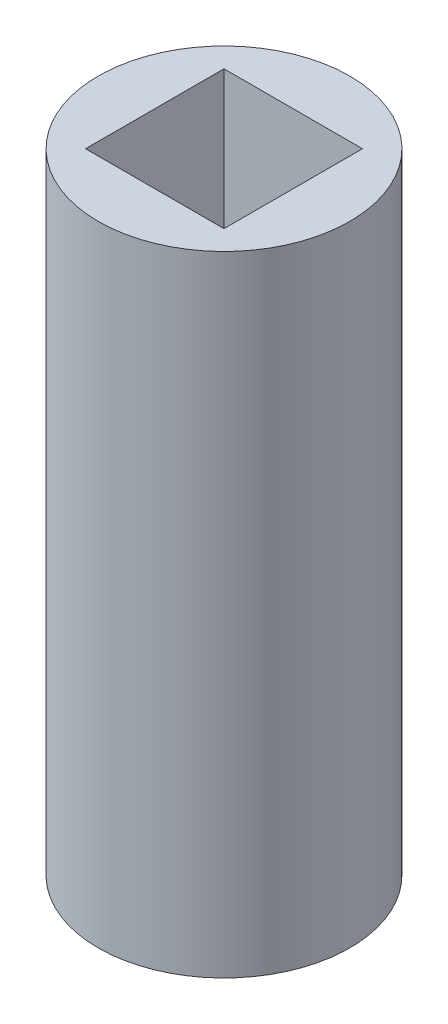
ISO-10303-21;
HEADER;
FILE_DESCRIPTION(('STEP AP214'),'2;1');
FILE_NAME('part.step','',(''),(''),'','','');
FILE_SCHEMA(('AUTOMOTIVE_DESIGN { 1 0 10303 214 1 1 1 1 }'));
ENDSEC;
DATA;
#1=APPLICATION_CONTEXT('core data for automotive mechanical design processes');
#2=APPLICATION_PROTOCOL_DEFINITION('international standard','automotive_design',2000,#1);
#3=PRODUCT_CONTEXT('',#1,'mechanical');
#4=PRODUCT('Part','Part','',(#3));
#5=PRODUCT_RELATED_PRODUCT_CATEGORY('part','',(#4));
#6=PRODUCT_DEFINITION_FORMATION('','',#4);
#7=PRODUCT_DEFINITION_CONTEXT('part definition',#1,'design');
#8=PRODUCT_DEFINITION('design','',#6,#7);
#9=PRODUCT_DEFINITION_SHAPE('','',#8);
#10=(LENGTH_UNIT() NAMED_UNIT(*) SI_UNIT(.MILLI.,.METRE.));
#11=(NAMED_UNIT(*) PLANE_ANGLE_UNIT() SI_UNIT($,.RADIAN.));
#12=(NAMED_UNIT(*) SI_UNIT($,.STERADIAN.) SOLID_ANGLE_UNIT());
#13=UNCERTAINTY_MEASURE_WITH_UNIT(LENGTH_MEASURE(1.E-05),#10,'distance_accuracy_value','');
#14=(GEOMETRIC_REPRESENTATION_CONTEXT(3) GLOBAL_UNCERTAINTY_ASSIGNED_CONTEXT((#13)) GLOBAL_UNIT_ASSIGNED_CONTEXT((#10,
#11,#12)) REPRESENTATION_CONTEXT('',''));
#15=CARTESIAN_POINT('',(0.,0.,0.));
#16=DIRECTION('',(0.,0.,1.));
#17=DIRECTION('',(1.,0.,0.));
#18=AXIS2_PLACEMENT_3D('',#15,#16,#17);
#19=CARTESIAN_POINT('',(0.,30.,0.));
#20=DIRECTION('',(0.,1.,0.));
#21=DIRECTION('',(0.,0.,1.));
#22=AXIS2_PLACEMENT_3D('',#19,#20,#21);
#23=PLANE('',#22);
#24=CARTESIAN_POINT('',(0.,30.,0.));
#25=DIRECTION('',(0.,1.,0.));
#26=DIRECTION('',(0.,0.,1.));
#27=AXIS2_PLACEMENT_3D('',#24,#25,#26);
#28=CIRCLE('',#27,6.);
#29=CARTESIAN_POINT('',(0.,30.,6.));
#30=VERTEX_POINT('',#29);
#31=EDGE_CURVE('E11',#30,#30,#28,.T.);
#32=ORIENTED_EDGE('',*,*,#31,.T.);
#33=EDGE_LOOP('',(#32));
#34=FACE_BOUND('',#33,.T.);
#35=DIRECTION('',(1.,0.,0.));
#36=VECTOR('',#35,1.);
#37=CARTESIAN_POINT('',(-3.3,30.,3.3));
#38=LINE('',#37,#36);
#39=CARTESIAN_POINT('',(-3.3,30.,3.3));
#40=VERTEX_POINT('',#39);
#41=CARTESIAN_POINT('',(3.3,30.,3.3));
#42=VERTEX_POINT('',#41);
#43=EDGE_CURVE('E90',#40,#42,#38,.T.);
#44=ORIENTED_EDGE('',*,*,#43,.F.);
#45=DIRECTION('',(0.,0.,1.));
#46=VECTOR('',#45,1.);
#47=CARTESIAN_POINT('',(-3.3,30.,-3.3));
#48=LINE('',#47,#46);
#49=CARTESIAN_POINT('',(-3.3,30.,-3.3));
#50=VERTEX_POINT('',#49);
#51=EDGE_CURVE('E81',#50,#40,#48,.T.);
#52=ORIENTED_EDGE('',*,*,#51,.F.);
#53=DIRECTION('',(-1.,0.,0.));
#54=VECTOR('',#53,1.);
#55=CARTESIAN_POINT('',(-3.3,30.,-3.3));
#56=LINE('',#55,#54);
#57=CARTESIAN_POINT('',(3.3,30.,-3.3));
#58=VERTEX_POINT('',#57);
#59=EDGE_CURVE('E106',#58,#50,#56,.T.);
#60=ORIENTED_EDGE('',*,*,#59,.F.);
#61=DIRECTION('',(0.,0.,-1.));
#62=VECTOR('',#61,1.);
#63=CARTESIAN_POINT('',(3.3,30.,-3.3));
#64=LINE('',#63,#62);
#65=EDGE_CURVE('E102',#42,#58,#64,.T.);
#66=ORIENTED_EDGE('',*,*,#65,.F.);
#67=EDGE_LOOP('',(#44,#52,#60,#66));
#68=FACE_BOUND('',#67,.T.);
#69=ADVANCED_FACE('F39',(#34,#68),#23,.T.);
#70=CARTESIAN_POINT('',(0.,0.,0.));
#71=DIRECTION('',(0.,1.,0.));
#72=DIRECTION('',(0.,0.,1.));
#73=AXIS2_PLACEMENT_3D('',#70,#71,#72);
#74=PLANE('',#73);
#75=CARTESIAN_POINT('',(0.,0.,0.));
#76=DIRECTION('',(0.,1.,0.));
#77=DIRECTION('',(0.,0.,1.));
#78=AXIS2_PLACEMENT_3D('',#75,#76,#77);
#79=CIRCLE('',#78,6.);
#80=CARTESIAN_POINT('',(0.,0.,6.));
#81=VERTEX_POINT('',#80);
#82=EDGE_CURVE('E43',#81,#81,#79,.T.);
#83=ORIENTED_EDGE('',*,*,#82,.F.);
#84=EDGE_LOOP('',(#83));
#85=FACE_BOUND('',#84,.T.);
#86=DIRECTION('',(0.,0.,1.));
#87=VECTOR('',#86,1.);
#88=CARTESIAN_POINT('',(-3.3,0.,-3.3));
#89=LINE('',#88,#87);
#90=CARTESIAN_POINT('',(-3.3,0.,-3.3));
#91=VERTEX_POINT('',#90);
#92=CARTESIAN_POINT('',(-3.3,0.,3.3));
#93=VERTEX_POINT('',#92);
#94=EDGE_CURVE('E63',#91,#93,#89,.T.);
#95=ORIENTED_EDGE('',*,*,#94,.T.);
#96=DIRECTION('',(1.,0.,0.));
#97=VECTOR('',#96,1.);
#98=CARTESIAN_POINT('',(-3.3,0.,3.3));
#99=LINE('',#98,#97);
#100=CARTESIAN_POINT('',(3.3,0.,3.3));
#101=VERTEX_POINT('',#100);
#102=EDGE_CURVE('E97',#93,#101,#99,.T.);
#103=ORIENTED_EDGE('',*,*,#102,.T.);
#104=DIRECTION('',(0.,0.,-1.));
#105=VECTOR('',#104,1.);
#106=CARTESIAN_POINT('',(3.3,0.,-3.3));
#107=LINE('',#106,#105);
#108=CARTESIAN_POINT('',(3.3,0.,-3.3));
#109=VERTEX_POINT('',#108);
#110=EDGE_CURVE('E115',#101,#109,#107,.T.);
#111=ORIENTED_EDGE('',*,*,#110,.T.);
#112=DIRECTION('',(-1.,0.,0.));
#113=VECTOR('',#112,1.);
#114=CARTESIAN_POINT('',(-3.3,0.,-3.3));
#115=LINE('',#114,#113);
#116=EDGE_CURVE('E91',#109,#91,#115,.T.);
#117=ORIENTED_EDGE('',*,*,#116,.T.);
#118=EDGE_LOOP('',(#95,#103,#111,#117));
#119=FACE_BOUND('',#118,.T.);
#120=ADVANCED_FACE('F131',(#85,#119),#74,.F.);
#121=CARTESIAN_POINT('',(0.,30.,0.));
#122=DIRECTION('',(0.,-1.,0.));
#123=DIRECTION('',(0.,0.,-1.));
#124=AXIS2_PLACEMENT_3D('',#121,#122,#123);
#125=CYLINDRICAL_SURFACE('',#124,6.);
#126=ORIENTED_EDGE('',*,*,#31,.F.);
#127=EDGE_LOOP('',(#126));
#128=FACE_BOUND('',#127,.T.);
#129=ORIENTED_EDGE('',*,*,#82,.T.);
#130=EDGE_LOOP('',(#129));
#131=FACE_BOUND('',#130,.T.);
#132=ADVANCED_FACE('F41',(#128,#131),#125,.T.);
#133=CARTESIAN_POINT('',(-3.3,30.,-3.3));
#134=DIRECTION('',(1.,0.,0.));
#135=DIRECTION('',(0.,0.,-1.));
#136=AXIS2_PLACEMENT_3D('',#133,#134,#135);
#137=PLANE('',#136);
#138=ORIENTED_EDGE('',*,*,#94,.F.);
#139=DIRECTION('',(0.,-1.,0.));
#140=VECTOR('',#139,1.);
#141=CARTESIAN_POINT('',(-3.3,30.,-3.3));
#142=LINE('',#141,#140);
#143=EDGE_CURVE('E85',#50,#91,#142,.T.);
#144=ORIENTED_EDGE('',*,*,#143,.F.);
#145=ORIENTED_EDGE('',*,*,#51,.T.);
#146=DIRECTION('',(0.,-1.,0.));
#147=VECTOR('',#146,1.);
#148=CARTESIAN_POINT('',(-3.3,30.,3.3));
#149=LINE('',#148,#147);
#150=EDGE_CURVE('E84',#40,#93,#149,.T.);
#151=ORIENTED_EDGE('',*,*,#150,.T.);
#152=EDGE_LOOP('',(#138,#144,#145,#151));
#153=FACE_BOUND('',#152,.T.);
#154=ADVANCED_FACE('F83',(#153),#137,.T.);
#155=CARTESIAN_POINT('',(-3.3,30.,3.3));
#156=DIRECTION('',(0.,0.,-1.));
#157=DIRECTION('',(-1.,0.,0.));
#158=AXIS2_PLACEMENT_3D('',#155,#156,#157);
#159=PLANE('',#158);
#160=ORIENTED_EDGE('',*,*,#102,.F.);
#161=ORIENTED_EDGE('',*,*,#150,.F.);
#162=ORIENTED_EDGE('',*,*,#43,.T.);
#163=DIRECTION('',(0.,-1.,0.));
#164=VECTOR('',#163,1.);
#165=CARTESIAN_POINT('',(3.3,30.,3.3));
#166=LINE('',#165,#164);
#167=EDGE_CURVE('E99',#42,#101,#166,.T.);
#168=ORIENTED_EDGE('',*,*,#167,.T.);
#169=EDGE_LOOP('',(#160,#161,#162,#168));
#170=FACE_BOUND('',#169,.T.);
#171=ADVANCED_FACE('F94',(#170),#159,.T.);
#172=CARTESIAN_POINT('',(3.3,30.,-3.3));
#173=DIRECTION('',(-1.,0.,0.));
#174=DIRECTION('',(0.,0.,1.));
#175=AXIS2_PLACEMENT_3D('',#172,#173,#174);
#176=PLANE('',#175);
#177=ORIENTED_EDGE('',*,*,#110,.F.);
#178=ORIENTED_EDGE('',*,*,#167,.F.);
#179=ORIENTED_EDGE('',*,*,#65,.T.);
#180=DIRECTION('',(0.,-1.,0.));
#181=VECTOR('',#180,1.);
#182=CARTESIAN_POINT('',(3.3,30.,-3.3));
#183=LINE('',#182,#181);
#184=EDGE_CURVE('E55',#58,#109,#183,.T.);
#185=ORIENTED_EDGE('',*,*,#184,.T.);
#186=EDGE_LOOP('',(#177,#178,#179,#185));
#187=FACE_BOUND('',#186,.T.);
#188=ADVANCED_FACE('F129',(#187),#176,.T.);
#189=CARTESIAN_POINT('',(-3.3,30.,-3.3));
#190=DIRECTION('',(0.,0.,1.));
#191=DIRECTION('',(1.,0.,0.));
#192=AXIS2_PLACEMENT_3D('',#189,#190,#191);
#193=PLANE('',#192);
#194=ORIENTED_EDGE('',*,*,#116,.F.);
#195=ORIENTED_EDGE('',*,*,#184,.F.);
#196=ORIENTED_EDGE('',*,*,#59,.T.);
#197=ORIENTED_EDGE('',*,*,#143,.T.);
#198=EDGE_LOOP('',(#194,#195,#196,#197));
#199=FACE_BOUND('',#198,.T.);
#200=ADVANCED_FACE('F132',(#199),#193,.T.);
#201=CLOSED_SHELL('',(#69,#120,#132,#154,#171,#188,#200));
#202=MANIFOLD_SOLID_BREP('B2',#201);
#203=ADVANCED_BREP_SHAPE_REPRESENTATION('',(#18,#202),#14);
#204=SHAPE_DEFINITION_REPRESENTATION(#9,#203);
ENDSEC;
END-ISO-10303-21;
